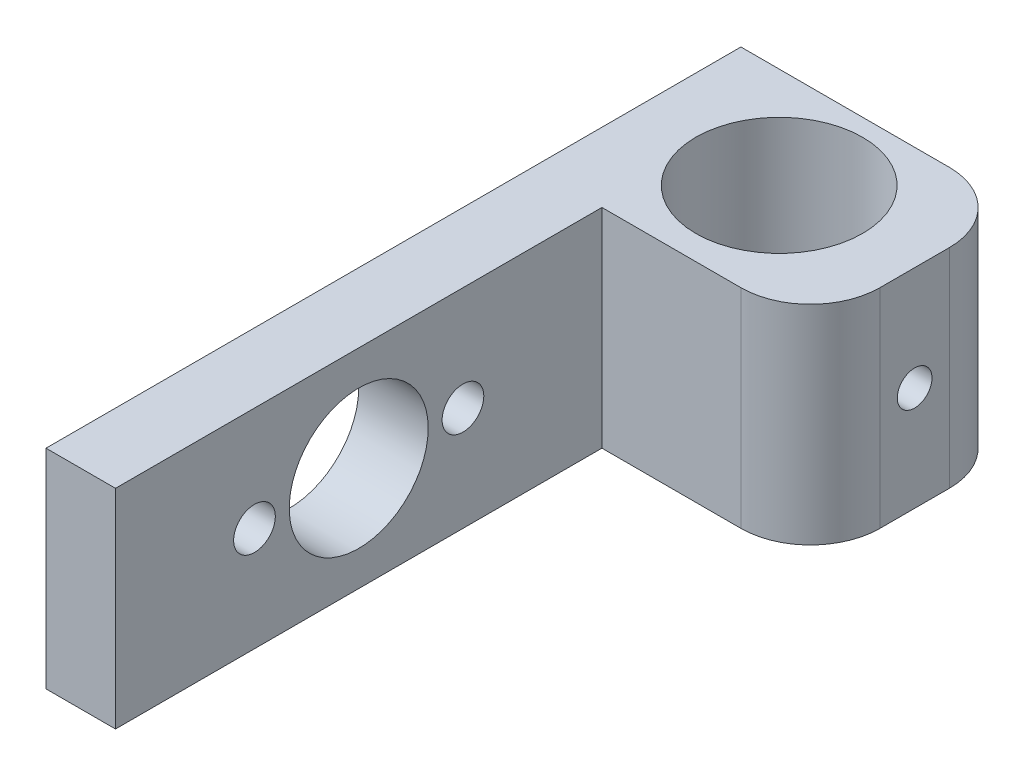
ISO-10303-21;
HEADER;
FILE_DESCRIPTION(('STEP AP214'),'2;1');
FILE_NAME('part.step','',(''),(''),'','','');
FILE_SCHEMA(('AUTOMOTIVE_DESIGN { 1 0 10303 214 1 1 1 1 }'));
ENDSEC;
DATA;
#1=APPLICATION_CONTEXT('core data for automotive mechanical design processes');
#2=APPLICATION_PROTOCOL_DEFINITION('international standard','automotive_design',2000,#1);
#3=PRODUCT_CONTEXT('',#1,'mechanical');
#4=PRODUCT('Part','Part','',(#3));
#5=PRODUCT_RELATED_PRODUCT_CATEGORY('part','',(#4));
#6=PRODUCT_DEFINITION_FORMATION('','',#4);
#7=PRODUCT_DEFINITION_CONTEXT('part definition',#1,'design');
#8=PRODUCT_DEFINITION('design','',#6,#7);
#9=PRODUCT_DEFINITION_SHAPE('','',#8);
#10=(LENGTH_UNIT() NAMED_UNIT(*) SI_UNIT(.MILLI.,.METRE.));
#11=(NAMED_UNIT(*) PLANE_ANGLE_UNIT() SI_UNIT($,.RADIAN.));
#12=(NAMED_UNIT(*) SI_UNIT($,.STERADIAN.) SOLID_ANGLE_UNIT());
#13=UNCERTAINTY_MEASURE_WITH_UNIT(LENGTH_MEASURE(1.E-05),#10,'distance_accuracy_value','');
#14=(GEOMETRIC_REPRESENTATION_CONTEXT(3) GLOBAL_UNCERTAINTY_ASSIGNED_CONTEXT((#13)) GLOBAL_UNIT_ASSIGNED_CONTEXT((#10,
#11,#12)) REPRESENTATION_CONTEXT('',''));
#15=CARTESIAN_POINT('',(0.,0.,0.));
#16=DIRECTION('',(0.,0.,1.));
#17=DIRECTION('',(1.,0.,0.));
#18=AXIS2_PLACEMENT_3D('',#15,#16,#17);
#19=CARTESIAN_POINT('',(2.5,0.,0.));
#20=DIRECTION('',(-1.,0.,0.));
#21=DIRECTION('',(0.,0.,1.));
#22=AXIS2_PLACEMENT_3D('',#19,#20,#21);
#23=PLANE('',#22);
#24=CARTESIAN_POINT('',(2.5,7.5,-25.));
#25=DIRECTION('',(1.,0.,0.));
#26=DIRECTION('',(0.,0.,-1.));
#27=AXIS2_PLACEMENT_3D('',#24,#25,#26);
#28=CIRCLE('',#27,1.5);
#29=CARTESIAN_POINT('',(2.5,7.5,-26.5));
#30=VERTEX_POINT('',#29);
#31=EDGE_CURVE('E173',#30,#30,#28,.T.);
#32=ORIENTED_EDGE('',*,*,#31,.F.);
#33=EDGE_LOOP('',(#32));
#34=FACE_BOUND('',#33,.T.);
#35=CARTESIAN_POINT('',(2.5,7.5,-17.5));
#36=DIRECTION('',(1.,0.,0.));
#37=DIRECTION('',(0.,0.,-1.));
#38=AXIS2_PLACEMENT_3D('',#35,#36,#37);
#39=CIRCLE('',#38,5.);
#40=CARTESIAN_POINT('',(2.5,7.5,-22.5));
#41=VERTEX_POINT('',#40);
#42=EDGE_CURVE('E179',#41,#41,#39,.T.);
#43=ORIENTED_EDGE('',*,*,#42,.F.);
#44=EDGE_LOOP('',(#43));
#45=FACE_BOUND('',#44,.T.);
#46=CARTESIAN_POINT('',(2.5,7.5,-10.));
#47=DIRECTION('',(1.,0.,0.));
#48=DIRECTION('',(0.,0.,-1.));
#49=AXIS2_PLACEMENT_3D('',#46,#47,#48);
#50=CIRCLE('',#49,1.5);
#51=CARTESIAN_POINT('',(2.5,7.5,-11.5));
#52=VERTEX_POINT('',#51);
#53=EDGE_CURVE('E185',#52,#52,#50,.T.);
#54=ORIENTED_EDGE('',*,*,#53,.F.);
#55=EDGE_LOOP('',(#54));
#56=FACE_BOUND('',#55,.T.);
#57=DIRECTION('',(0.,0.,-1.));
#58=VECTOR('',#57,1.);
#59=CARTESIAN_POINT('',(2.5,0.,0.));
#60=LINE('',#59,#58);
#61=CARTESIAN_POINT('',(2.5,0.,0.));
#62=VERTEX_POINT('',#61);
#63=CARTESIAN_POINT('',(2.5,0.,-35.));
#64=VERTEX_POINT('',#63);
#65=EDGE_CURVE('E102',#62,#64,#60,.T.);
#66=ORIENTED_EDGE('',*,*,#65,.T.);
#67=DIRECTION('',(0.,1.,0.));
#68=VECTOR('',#67,1.);
#69=CARTESIAN_POINT('',(2.5,0.,-35.));
#70=LINE('',#69,#68);
#71=CARTESIAN_POINT('',(2.5,15.,-35.));
#72=VERTEX_POINT('',#71);
#73=EDGE_CURVE('E154',#64,#72,#70,.T.);
#74=ORIENTED_EDGE('',*,*,#73,.T.);
#75=DIRECTION('',(0.,0.,1.));
#76=VECTOR('',#75,1.);
#77=CARTESIAN_POINT('',(2.5,15.,0.));
#78=LINE('',#77,#76);
#79=CARTESIAN_POINT('',(2.5,15.,0.));
#80=VERTEX_POINT('',#79);
#81=EDGE_CURVE('E113',#72,#80,#78,.T.);
#82=ORIENTED_EDGE('',*,*,#81,.T.);
#83=DIRECTION('',(0.,-1.,0.));
#84=VECTOR('',#83,1.);
#85=CARTESIAN_POINT('',(2.5,0.,0.));
#86=LINE('',#85,#84);
#87=EDGE_CURVE('E114',#80,#62,#86,.T.);
#88=ORIENTED_EDGE('',*,*,#87,.T.);
#89=EDGE_LOOP('',(#66,#74,#82,#88));
#90=FACE_BOUND('',#89,.T.);
#91=ADVANCED_FACE('F33',(#34,#45,#56,#90),#23,.F.);
#92=CARTESIAN_POINT('',(-2.5,0.,0.));
#93=DIRECTION('',(-1.,0.,0.));
#94=DIRECTION('',(0.,0.,1.));
#95=AXIS2_PLACEMENT_3D('',#92,#93,#94);
#96=PLANE('',#95);
#97=DIRECTION('',(0.,-1.,0.));
#98=VECTOR('',#97,1.);
#99=CARTESIAN_POINT('',(-2.5,0.,0.));
#100=LINE('',#99,#98);
#101=CARTESIAN_POINT('',(-2.5,15.,0.));
#102=VERTEX_POINT('',#101);
#103=CARTESIAN_POINT('',(-2.5,0.,0.));
#104=VERTEX_POINT('',#103);
#105=EDGE_CURVE('E125',#102,#104,#100,.T.);
#106=ORIENTED_EDGE('',*,*,#105,.F.);
#107=DIRECTION('',(0.,0.,1.));
#108=VECTOR('',#107,1.);
#109=CARTESIAN_POINT('',(-2.5,15.,0.));
#110=LINE('',#109,#108);
#111=CARTESIAN_POINT('',(-2.5,15.,-50.));
#112=VERTEX_POINT('',#111);
#113=EDGE_CURVE('E121',#112,#102,#110,.T.);
#114=ORIENTED_EDGE('',*,*,#113,.F.);
#115=DIRECTION('',(0.,1.,0.));
#116=VECTOR('',#115,1.);
#117=CARTESIAN_POINT('',(-2.5,0.,-50.));
#118=LINE('',#117,#116);
#119=CARTESIAN_POINT('',(-2.5,0.,-50.));
#120=VERTEX_POINT('',#119);
#121=EDGE_CURVE('E195',#120,#112,#118,.T.);
#122=ORIENTED_EDGE('',*,*,#121,.F.);
#123=DIRECTION('',(0.,0.,-1.));
#124=VECTOR('',#123,1.);
#125=CARTESIAN_POINT('',(-2.5,0.,0.));
#126=LINE('',#125,#124);
#127=EDGE_CURVE('E193',#104,#120,#126,.T.);
#128=ORIENTED_EDGE('',*,*,#127,.F.);
#129=EDGE_LOOP('',(#106,#114,#122,#128));
#130=FACE_BOUND('',#129,.T.);
#131=CARTESIAN_POINT('',(-2.5,7.5,-17.5));
#132=DIRECTION('',(1.,0.,0.));
#133=DIRECTION('',(0.,0.,-1.));
#134=AXIS2_PLACEMENT_3D('',#131,#132,#133);
#135=CIRCLE('',#134,5.);
#136=CARTESIAN_POINT('',(-2.5,7.5,-22.5));
#137=VERTEX_POINT('',#136);
#138=EDGE_CURVE('E176',#137,#137,#135,.T.);
#139=ORIENTED_EDGE('',*,*,#138,.T.);
#140=EDGE_LOOP('',(#139));
#141=FACE_BOUND('',#140,.T.);
#142=CARTESIAN_POINT('',(-2.5,7.5,-10.));
#143=DIRECTION('',(1.,0.,0.));
#144=DIRECTION('',(0.,0.,-1.));
#145=AXIS2_PLACEMENT_3D('',#142,#143,#144);
#146=CIRCLE('',#145,1.5);
#147=CARTESIAN_POINT('',(-2.5,7.5,-11.5));
#148=VERTEX_POINT('',#147);
#149=EDGE_CURVE('E182',#148,#148,#146,.T.);
#150=ORIENTED_EDGE('',*,*,#149,.T.);
#151=EDGE_LOOP('',(#150));
#152=FACE_BOUND('',#151,.T.);
#153=CARTESIAN_POINT('',(-2.5,7.5,-25.));
#154=DIRECTION('',(1.,0.,0.));
#155=DIRECTION('',(0.,0.,-1.));
#156=AXIS2_PLACEMENT_3D('',#153,#154,#155);
#157=CIRCLE('',#156,1.5);
#158=CARTESIAN_POINT('',(-2.5,7.5,-26.5));
#159=VERTEX_POINT('',#158);
#160=EDGE_CURVE('E172',#159,#159,#157,.T.);
#161=ORIENTED_EDGE('',*,*,#160,.T.);
#162=EDGE_LOOP('',(#161));
#163=FACE_BOUND('',#162,.T.);
#164=ADVANCED_FACE('F203',(#130,#141,#152,#163),#96,.T.);
#165=CARTESIAN_POINT('',(2.5,0.,0.));
#166=DIRECTION('',(0.,0.,-1.));
#167=DIRECTION('',(-1.,0.,0.));
#168=AXIS2_PLACEMENT_3D('',#165,#166,#167);
#169=PLANE('',#168);
#170=ORIENTED_EDGE('',*,*,#105,.T.);
#171=DIRECTION('',(-1.,0.,0.));
#172=VECTOR('',#171,1.);
#173=CARTESIAN_POINT('',(2.5,0.,0.));
#174=LINE('',#173,#172);
#175=EDGE_CURVE('E107',#62,#104,#174,.T.);
#176=ORIENTED_EDGE('',*,*,#175,.F.);
#177=ORIENTED_EDGE('',*,*,#87,.F.);
#178=DIRECTION('',(-1.,0.,0.));
#179=VECTOR('',#178,1.);
#180=CARTESIAN_POINT('',(2.5,15.,0.));
#181=LINE('',#180,#179);
#182=EDGE_CURVE('E191',#80,#102,#181,.T.);
#183=ORIENTED_EDGE('',*,*,#182,.T.);
#184=EDGE_LOOP('',(#170,#176,#177,#183));
#185=FACE_BOUND('',#184,.T.);
#186=ADVANCED_FACE('F123',(#185),#169,.F.);
#187=CARTESIAN_POINT('',(2.5,0.,0.));
#188=DIRECTION('',(0.,1.,0.));
#189=DIRECTION('',(0.,0.,1.));
#190=AXIS2_PLACEMENT_3D('',#187,#188,#189);
#191=PLANE('',#190);
#192=CARTESIAN_POINT('',(7.5,0.,-42.75390625));
#193=DIRECTION('',(0.,1.,0.));
#194=DIRECTION('',(0.,0.,1.));
#195=AXIS2_PLACEMENT_3D('',#192,#193,#194);
#196=CIRCLE('',#195,6.);
#197=CARTESIAN_POINT('',(7.5,0.,-36.75390625));
#198=VERTEX_POINT('',#197);
#199=EDGE_CURVE('E167',#198,#198,#196,.T.);
#200=ORIENTED_EDGE('',*,*,#199,.T.);
#201=EDGE_LOOP('',(#200));
#202=FACE_BOUND('',#201,.T.);
#203=DIRECTION('',(0.,0.,-1.));
#204=VECTOR('',#203,1.);
#205=CARTESIAN_POINT('',(17.5,0.,-50.));
#206=LINE('',#205,#204);
#207=CARTESIAN_POINT('',(17.5,0.,-40.));
#208=VERTEX_POINT('',#207);
#209=CARTESIAN_POINT('',(17.5,0.,-45.));
#210=VERTEX_POINT('',#209);
#211=EDGE_CURVE('E146',#208,#210,#206,.T.);
#212=ORIENTED_EDGE('',*,*,#211,.F.);
#213=CARTESIAN_POINT('',(12.5,0.,-40.));
#214=DIRECTION('',(0.,1.,0.));
#215=DIRECTION('',(0.,0.,1.));
#216=AXIS2_PLACEMENT_3D('',#213,#214,#215);
#217=CIRCLE('',#216,5.);
#218=CARTESIAN_POINT('',(12.5,0.,-35.));
#219=VERTEX_POINT('',#218);
#220=EDGE_CURVE('E46',#208,#219,#217,.F.);
#221=ORIENTED_EDGE('',*,*,#220,.T.);
#222=DIRECTION('',(1.,0.,0.));
#223=VECTOR('',#222,1.);
#224=CARTESIAN_POINT('',(-2.5,0.,-35.));
#225=LINE('',#224,#223);
#226=EDGE_CURVE('E110',#64,#219,#225,.T.);
#227=ORIENTED_EDGE('',*,*,#226,.F.);
#228=ORIENTED_EDGE('',*,*,#65,.F.);
#229=ORIENTED_EDGE('',*,*,#175,.T.);
#230=ORIENTED_EDGE('',*,*,#127,.T.);
#231=DIRECTION('',(-1.,0.,0.));
#232=VECTOR('',#231,1.);
#233=CARTESIAN_POINT('',(2.5,0.,-50.));
#234=LINE('',#233,#232);
#235=CARTESIAN_POINT('',(12.5,0.,-50.));
#236=VERTEX_POINT('',#235);
#237=EDGE_CURVE('E127',#236,#120,#234,.T.);
#238=ORIENTED_EDGE('',*,*,#237,.F.);
#239=CARTESIAN_POINT('',(12.5,0.,-45.));
#240=DIRECTION('',(0.,1.,0.));
#241=DIRECTION('',(0.,0.,1.));
#242=AXIS2_PLACEMENT_3D('',#239,#240,#241);
#243=CIRCLE('',#242,5.);
#244=EDGE_CURVE('E58',#236,#210,#243,.F.);
#245=ORIENTED_EDGE('',*,*,#244,.T.);
#246=EDGE_LOOP('',(#212,#221,#227,#228,#229,#230,#238,#245));
#247=FACE_BOUND('',#246,.T.);
#248=ADVANCED_FACE('F104',(#202,#247),#191,.F.);
#249=CARTESIAN_POINT('',(2.5,0.,-50.));
#250=DIRECTION('',(0.,0.,1.));
#251=DIRECTION('',(1.,0.,0.));
#252=AXIS2_PLACEMENT_3D('',#249,#250,#251);
#253=PLANE('',#252);
#254=DIRECTION('',(-1.,0.,0.));
#255=VECTOR('',#254,1.);
#256=CARTESIAN_POINT('',(2.5,15.,-50.));
#257=LINE('',#256,#255);
#258=CARTESIAN_POINT('',(12.5,15.,-50.));
#259=VERTEX_POINT('',#258);
#260=EDGE_CURVE('E132',#259,#112,#257,.T.);
#261=ORIENTED_EDGE('',*,*,#260,.F.);
#262=DIRECTION('',(0.,1.,0.));
#263=VECTOR('',#262,1.);
#264=CARTESIAN_POINT('',(12.5,0.,-50.));
#265=LINE('',#264,#263);
#266=EDGE_CURVE('E11',#259,#236,#265,.F.);
#267=ORIENTED_EDGE('',*,*,#266,.T.);
#268=ORIENTED_EDGE('',*,*,#237,.T.);
#269=ORIENTED_EDGE('',*,*,#121,.T.);
#270=EDGE_LOOP('',(#261,#267,#268,#269));
#271=FACE_BOUND('',#270,.T.);
#272=ADVANCED_FACE('F201',(#271),#253,.F.);
#273=CARTESIAN_POINT('',(2.5,15.,0.));
#274=DIRECTION('',(0.,-1.,0.));
#275=DIRECTION('',(0.,0.,-1.));
#276=AXIS2_PLACEMENT_3D('',#273,#274,#275);
#277=PLANE('',#276);
#278=CARTESIAN_POINT('',(7.5,15.,-42.75390625));
#279=DIRECTION('',(0.,1.,0.));
#280=DIRECTION('',(0.,0.,1.));
#281=AXIS2_PLACEMENT_3D('',#278,#279,#280);
#282=CIRCLE('',#281,6.);
#283=CARTESIAN_POINT('',(7.5,15.,-36.75390625));
#284=VERTEX_POINT('',#283);
#285=EDGE_CURVE('E357',#284,#284,#282,.T.);
#286=ORIENTED_EDGE('',*,*,#285,.F.);
#287=EDGE_LOOP('',(#286));
#288=FACE_BOUND('',#287,.T.);
#289=DIRECTION('',(1.,0.,0.));
#290=VECTOR('',#289,1.);
#291=CARTESIAN_POINT('',(-2.5,15.,-35.));
#292=LINE('',#291,#290);
#293=CARTESIAN_POINT('',(12.5,15.,-35.));
#294=VERTEX_POINT('',#293);
#295=EDGE_CURVE('E162',#72,#294,#292,.T.);
#296=ORIENTED_EDGE('',*,*,#295,.T.);
#297=CARTESIAN_POINT('',(12.5,15.,-40.));
#298=DIRECTION('',(0.,-1.,0.));
#299=DIRECTION('',(0.,0.,-1.));
#300=AXIS2_PLACEMENT_3D('',#297,#298,#299);
#301=CIRCLE('',#300,5.);
#302=CARTESIAN_POINT('',(17.5,15.,-40.));
#303=VERTEX_POINT('',#302);
#304=EDGE_CURVE('E137',#294,#303,#301,.F.);
#305=ORIENTED_EDGE('',*,*,#304,.T.);
#306=DIRECTION('',(0.,0.,-1.));
#307=VECTOR('',#306,1.);
#308=CARTESIAN_POINT('',(17.5,15.,-50.));
#309=LINE('',#308,#307);
#310=CARTESIAN_POINT('',(17.5,15.,-45.));
#311=VERTEX_POINT('',#310);
#312=EDGE_CURVE('E155',#303,#311,#309,.T.);
#313=ORIENTED_EDGE('',*,*,#312,.T.);
#314=CARTESIAN_POINT('',(12.5,15.,-45.));
#315=DIRECTION('',(0.,-1.,0.));
#316=DIRECTION('',(0.,0.,-1.));
#317=AXIS2_PLACEMENT_3D('',#314,#315,#316);
#318=CIRCLE('',#317,5.);
#319=EDGE_CURVE('E130',#311,#259,#318,.F.);
#320=ORIENTED_EDGE('',*,*,#319,.T.);
#321=ORIENTED_EDGE('',*,*,#260,.T.);
#322=ORIENTED_EDGE('',*,*,#113,.T.);
#323=ORIENTED_EDGE('',*,*,#182,.F.);
#324=ORIENTED_EDGE('',*,*,#81,.F.);
#325=EDGE_LOOP('',(#296,#305,#313,#320,#321,#322,#323,#324));
#326=FACE_BOUND('',#325,.T.);
#327=ADVANCED_FACE('F161',(#288,#326),#277,.F.);
#328=CARTESIAN_POINT('',(2.5,7.5,-10.));
#329=DIRECTION('',(-1.,0.,0.));
#330=DIRECTION('',(0.,0.,1.));
#331=AXIS2_PLACEMENT_3D('',#328,#329,#330);
#332=CYLINDRICAL_SURFACE('',#331,1.5);
#333=ORIENTED_EDGE('',*,*,#53,.T.);
#334=EDGE_LOOP('',(#333));
#335=FACE_BOUND('',#334,.T.);
#336=ORIENTED_EDGE('',*,*,#149,.F.);
#337=EDGE_LOOP('',(#336));
#338=FACE_BOUND('',#337,.T.);
#339=ADVANCED_FACE('F224',(#335,#338),#332,.F.);
#340=CARTESIAN_POINT('',(2.5,7.5,-17.5));
#341=DIRECTION('',(-1.,0.,0.));
#342=DIRECTION('',(0.,0.,1.));
#343=AXIS2_PLACEMENT_3D('',#340,#341,#342);
#344=CYLINDRICAL_SURFACE('',#343,5.);
#345=ORIENTED_EDGE('',*,*,#42,.T.);
#346=EDGE_LOOP('',(#345));
#347=FACE_BOUND('',#346,.T.);
#348=ORIENTED_EDGE('',*,*,#138,.F.);
#349=EDGE_LOOP('',(#348));
#350=FACE_BOUND('',#349,.T.);
#351=ADVANCED_FACE('F259',(#347,#350),#344,.F.);
#352=CARTESIAN_POINT('',(2.5,7.5,-25.));
#353=DIRECTION('',(-1.,0.,0.));
#354=DIRECTION('',(0.,0.,1.));
#355=AXIS2_PLACEMENT_3D('',#352,#353,#354);
#356=CYLINDRICAL_SURFACE('',#355,1.5);
#357=ORIENTED_EDGE('',*,*,#31,.T.);
#358=EDGE_LOOP('',(#357));
#359=FACE_BOUND('',#358,.T.);
#360=ORIENTED_EDGE('',*,*,#160,.F.);
#361=EDGE_LOOP('',(#360));
#362=FACE_BOUND('',#361,.T.);
#363=ADVANCED_FACE('F266',(#359,#362),#356,.F.);
#364=CARTESIAN_POINT('',(-2.5,0.,-35.));
#365=DIRECTION('',(0.,0.,1.));
#366=DIRECTION('',(1.,0.,0.));
#367=AXIS2_PLACEMENT_3D('',#364,#365,#366);
#368=PLANE('',#367);
#369=ORIENTED_EDGE('',*,*,#226,.T.);
#370=DIRECTION('',(0.,1.,0.));
#371=VECTOR('',#370,1.);
#372=CARTESIAN_POINT('',(12.5,0.,-35.));
#373=LINE('',#372,#371);
#374=EDGE_CURVE('E126',#219,#294,#373,.T.);
#375=ORIENTED_EDGE('',*,*,#374,.T.);
#376=ORIENTED_EDGE('',*,*,#295,.F.);
#377=ORIENTED_EDGE('',*,*,#73,.F.);
#378=EDGE_LOOP('',(#369,#375,#376,#377));
#379=FACE_BOUND('',#378,.T.);
#380=ADVANCED_FACE('F151',(#379),#368,.T.);
#381=CARTESIAN_POINT('',(17.5,0.,-50.));
#382=DIRECTION('',(1.,0.,0.));
#383=DIRECTION('',(0.,0.,-1.));
#384=AXIS2_PLACEMENT_3D('',#381,#382,#383);
#385=PLANE('',#384);
#386=CARTESIAN_POINT('',(17.5,7.5,-42.5));
#387=DIRECTION('',(1.,0.,0.));
#388=DIRECTION('',(0.,0.,-1.));
#389=AXIS2_PLACEMENT_3D('',#386,#387,#388);
#390=CIRCLE('',#389,1.25);
#391=CARTESIAN_POINT('',(17.5,7.5,-43.75));
#392=VERTEX_POINT('',#391);
#393=EDGE_CURVE('E360',#392,#392,#390,.T.);
#394=ORIENTED_EDGE('',*,*,#393,.F.);
#395=EDGE_LOOP('',(#394));
#396=FACE_BOUND('',#395,.T.);
#397=ORIENTED_EDGE('',*,*,#312,.F.);
#398=DIRECTION('',(0.,1.,0.));
#399=VECTOR('',#398,1.);
#400=CARTESIAN_POINT('',(17.5,0.,-40.));
#401=LINE('',#400,#399);
#402=EDGE_CURVE('E142',#303,#208,#401,.F.);
#403=ORIENTED_EDGE('',*,*,#402,.T.);
#404=ORIENTED_EDGE('',*,*,#211,.T.);
#405=DIRECTION('',(0.,1.,0.));
#406=VECTOR('',#405,1.);
#407=CARTESIAN_POINT('',(17.5,15.,-45.));
#408=LINE('',#407,#406);
#409=EDGE_CURVE('E139',#210,#311,#408,.T.);
#410=ORIENTED_EDGE('',*,*,#409,.T.);
#411=EDGE_LOOP('',(#397,#403,#404,#410));
#412=FACE_BOUND('',#411,.T.);
#413=ADVANCED_FACE('F164',(#396,#412),#385,.T.);
#414=CARTESIAN_POINT('',(7.5,0.,-42.75390625));
#415=DIRECTION('',(0.,1.,0.));
#416=DIRECTION('',(0.,0.,1.));
#417=AXIS2_PLACEMENT_3D('',#414,#415,#416);
#418=CYLINDRICAL_SURFACE('',#417,6.);
#419=CARTESIAN_POINT('',(13.4167387335602,7.5,-43.75));
#420=CARTESIAN_POINT('',(13.4167400077954,7.56974324668674,-43.7499975506617));
#421=CARTESIAN_POINT('',(13.4177337593835,7.63951730882965,-43.7441440613288));
#422=CARTESIAN_POINT('',(13.4215758942093,7.77709809268331,-43.7208978482761));
#423=CARTESIAN_POINT('',(13.4244256861345,7.84490327920308,-43.7034963597277));
#424=CARTESIAN_POINT('',(13.431585066293,7.97654705950757,-43.6576938794426));
#425=CARTESIAN_POINT('',(13.4358934887173,8.0403887730218,-43.6293016694376));
#426=CARTESIAN_POINT('',(13.4453827956153,8.1624061649833,-43.5623379763484));
#427=CARTESIAN_POINT('',(13.4505636213716,8.22058222434314,-43.5237671782373));
#428=CARTESIAN_POINT('',(13.4611358779627,8.33020357749358,-43.4371162408173));
#429=CARTESIAN_POINT('',(13.4665287863106,8.38158346841466,-43.3889535128124));
#430=CARTESIAN_POINT('',(13.476708318554,8.47557143368581,-43.2846580519193));
#431=CARTESIAN_POINT('',(13.4814949242603,8.51817924489797,-43.2285250800315));
#432=CARTESIAN_POINT('',(13.489739344699,8.59350492537374,-43.109678937748));
#433=CARTESIAN_POINT('',(13.4931937569996,8.6261974260254,-43.0469494324452));
#434=CARTESIAN_POINT('',(13.4981409728927,8.68056648451002,-42.9168141595911));
#435=CARTESIAN_POINT('',(13.4996339953849,8.70224427146763,-42.849408914757));
#436=CARTESIAN_POINT('',(13.5002422571054,8.73369457532439,-42.7129103916525));
#437=CARTESIAN_POINT('',(13.4993921333176,8.74363744525988,-42.6438565028178));
#438=CARTESIAN_POINT('',(13.495241927309,8.75191901545796,-42.5051332667403));
#439=CARTESIAN_POINT('',(13.4919420012647,8.7502584553903,-42.4354639590107));
#440=CARTESIAN_POINT('',(13.483056362156,8.735506642405,-42.2981298875272));
#441=CARTESIAN_POINT('',(13.4774911546459,8.72251676859139,-42.2304528343536));
#442=CARTESIAN_POINT('',(13.46444554504,8.68568723114659,-42.0983143477174));
#443=CARTESIAN_POINT('',(13.4569649808923,8.66184664934033,-42.0338531868925));
#444=CARTESIAN_POINT('',(13.4405443421678,8.60361649665601,-41.9089440376478));
#445=CARTESIAN_POINT('',(13.4315848379741,8.5690802505747,-41.8485670350382));
#446=CARTESIAN_POINT('',(13.413035927754,8.49054834518958,-41.7344184809309));
#447=CARTESIAN_POINT('',(13.4034464273402,8.44655126619081,-41.6806479227028));
#448=CARTESIAN_POINT('',(13.3842798289277,8.34923278304779,-41.5800528708754));
#449=CARTESIAN_POINT('',(13.3747072213355,8.29573495302856,-41.5333979793133));
#450=CARTESIAN_POINT('',(13.3567011109645,8.18149420704964,-41.4497247292716));
#451=CARTESIAN_POINT('',(13.3482675980977,8.12075135526242,-41.4127062854469));
#452=CARTESIAN_POINT('',(13.3334203250947,7.9938926056174,-41.3495339170659));
#453=CARTESIAN_POINT('',(13.3269994845679,7.92779659661038,-41.3233418004558));
#454=CARTESIAN_POINT('',(13.3168219462169,7.7919366556952,-41.2825019710134));
#455=CARTESIAN_POINT('',(13.3130646762347,7.72217351497918,-41.2678517788008));
#456=CARTESIAN_POINT('',(13.3086915327026,7.58305303006851,-41.2508500410415));
#457=CARTESIAN_POINT('',(13.3079907621906,7.51373887891018,-41.2481660751305));
#458=CARTESIAN_POINT('',(13.3095727977856,7.37565807665855,-41.2542817298796));
#459=CARTESIAN_POINT('',(13.3118553533871,7.30689138008409,-41.2630803863606));
#460=CARTESIAN_POINT('',(13.3191082423468,7.17285480766541,-41.2916513504533));
#461=CARTESIAN_POINT('',(13.3240401392731,7.10754925013277,-41.311266833859));
#462=CARTESIAN_POINT('',(13.3360720282212,6.98115736030538,-41.3607416802377));
#463=CARTESIAN_POINT('',(13.3431722559125,6.92007148752126,-41.3906021567529));
#464=CARTESIAN_POINT('',(13.359017861761,6.80253873184651,-41.4603801368602));
#465=CARTESIAN_POINT('',(13.3677926586465,6.74620573304002,-41.5004826460286));
#466=CARTESIAN_POINT('',(13.3860712328524,6.64096581514504,-41.5893382038589));
#467=CARTESIAN_POINT('',(13.3955751281325,6.59206010153615,-41.6380926539885));
#468=CARTESIAN_POINT('',(13.4147114574466,6.50174983773034,-41.7443651920547));
#469=CARTESIAN_POINT('',(13.4243407745908,6.46057431738032,-41.8020787583534));
#470=CARTESIAN_POINT('',(13.4426101707039,6.38850005317212,-41.9237474165327));
#471=CARTESIAN_POINT('',(13.4512502516281,6.35760128900207,-41.9877024960767));
#472=CARTESIAN_POINT('',(13.4667958790343,6.30704241508134,-42.1200469911921));
#473=CARTESIAN_POINT('',(13.4737030548572,6.2873717259207,-42.1884321647131));
#474=CARTESIAN_POINT('',(13.4852529597915,6.25989497618194,-42.3277296702338));
#475=CARTESIAN_POINT('',(13.4898960315427,6.25208711995447,-42.3986416180981));
#476=CARTESIAN_POINT('',(13.4965653161462,6.24868262620171,-42.5393053167587));
#477=CARTESIAN_POINT('',(13.4986471109394,6.25281985012794,-42.6090480598189));
#478=CARTESIAN_POINT('',(13.500391886196,6.2726495339532,-42.7468988898218));
#479=CARTESIAN_POINT('',(13.5000550120851,6.28834129906975,-42.8150070747974));
#480=CARTESIAN_POINT('',(13.4972542386614,6.3305923641642,-42.9469139321007));
#481=CARTESIAN_POINT('',(13.4948129081543,6.35703478655684,-43.0107506117937));
#482=CARTESIAN_POINT('',(13.4883170270629,6.42001415626258,-43.1331412526116));
#483=CARTESIAN_POINT('',(13.4842623938663,6.45655162048338,-43.1916949430222));
#484=CARTESIAN_POINT('',(13.4751202776846,6.53918930428422,-43.3026096534999));
#485=CARTESIAN_POINT('',(13.4700211372368,6.58539759628837,-43.354889168864));
#486=CARTESIAN_POINT('',(13.4595586108545,6.68584799559966,-43.4510477615695));
#487=CARTESIAN_POINT('',(13.4541951634099,6.7400919789394,-43.4949248717653));
#488=CARTESIAN_POINT('',(13.4438797490677,6.85590727578629,-43.5735970094237));
#489=CARTESIAN_POINT('',(13.4389341682082,6.91756607127303,-43.6082641386074));
#490=CARTESIAN_POINT('',(13.4302318491957,7.04588002347574,-43.6667206990804));
#491=CARTESIAN_POINT('',(13.4264741460256,7.1125310698123,-43.6905189671248));
#492=CARTESIAN_POINT('',(13.4213551722094,7.23272275503999,-43.7222770281762));
#493=CARTESIAN_POINT('',(13.4196368791354,7.28562279363465,-43.7326548103201));
#494=CARTESIAN_POINT('',(13.4173281827555,7.39234244992587,-43.7465171513742));
#495=CARTESIAN_POINT('',(13.4167377499205,7.44616204350987,-43.7500018907547));
#496=CARTESIAN_POINT('',(13.4167387335602,7.5,-43.75));
#497=B_SPLINE_CURVE_WITH_KNOTS('',3,(#419,#420,#421,#422,#423,#424,#425,#426,#427,#428,#429,
#430,#431,#432,#433,#434,#435,#436,#437,#438,#439,#440,#441,#442,#443,#444,#445,#446,#447,#448,
#449,#450,#451,#452,#453,#454,#455,#456,#457,#458,#459,#460,#461,#462,#463,#464,#465,#466,#467,
#468,#469,#470,#471,#472,#473,#474,#475,#476,#477,#478,#479,#480,#481,#482,#483,#484,#485,#486,
#487,#488,#489,#490,#491,#492,#493,#494,#495,#496),.UNSPECIFIED.,.T.,.F.,(4,2,2,2,2,2,2,2,2,2,2,
2,2,2,2,2,2,2,2,2,2,2,2,2,2,2,2,2,2,2,2,2,2,2,2,2,2,2,4),(0.,0.209033673387417,
0.418226183204796,0.627251889303491,0.836263532495572,1.04715933603153,1.25806146493161,
1.46949872744372,1.68091239062611,1.88921771159555,2.09750975410004,2.3039568232591,
2.51042136499271,2.71985299552608,2.92931607538115,3.14317837745654,3.35703878539666,
3.57013818270476,3.78319179054231,3.99028836083499,4.19736754265101,4.40152051473814,
4.60569568352129,4.81385796269949,5.02205399146659,5.23568257854515,5.44931074338727,
5.66273728804523,5.87613152360541,6.08480823503577,6.2934723996173,6.49992624078868,
6.70639065520634,6.91529893002761,7.12425605418552,7.33597895374127,7.54752940756618,
7.70889614921466,7.87025866598065),.UNSPECIFIED.);
#498=CARTESIAN_POINT('',(13.4167387335602,7.5,-43.75));
#499=VERTEX_POINT('',#498);
#500=EDGE_CURVE('E37',#499,#499,#497,.T.);
#501=ORIENTED_EDGE('',*,*,#500,.T.);
#502=EDGE_LOOP('',(#501));
#503=FACE_BOUND('',#502,.T.);
#504=ORIENTED_EDGE('',*,*,#199,.F.);
#505=EDGE_LOOP('',(#504));
#506=FACE_BOUND('',#505,.T.);
#507=ORIENTED_EDGE('',*,*,#285,.T.);
#508=EDGE_LOOP('',(#507));
#509=FACE_BOUND('',#508,.T.);
#510=ADVANCED_FACE('F213',(#503,#506,#509),#418,.F.);
#511=CARTESIAN_POINT('',(12.5,0.,-40.));
#512=DIRECTION('',(0.,1.,0.));
#513=DIRECTION('',(0.,0.,1.));
#514=AXIS2_PLACEMENT_3D('',#511,#512,#513);
#515=CYLINDRICAL_SURFACE('',#514,5.);
#516=ORIENTED_EDGE('',*,*,#220,.F.);
#517=ORIENTED_EDGE('',*,*,#402,.F.);
#518=ORIENTED_EDGE('',*,*,#304,.F.);
#519=ORIENTED_EDGE('',*,*,#374,.F.);
#520=EDGE_LOOP('',(#516,#517,#518,#519));
#521=FACE_BOUND('',#520,.T.);
#522=ADVANCED_FACE('F157',(#521),#515,.T.);
#523=CARTESIAN_POINT('',(12.5,0.,-45.));
#524=DIRECTION('',(0.,-1.,0.));
#525=DIRECTION('',(0.,0.,-1.));
#526=AXIS2_PLACEMENT_3D('',#523,#524,#525);
#527=CYLINDRICAL_SURFACE('',#526,5.);
#528=ORIENTED_EDGE('',*,*,#244,.F.);
#529=ORIENTED_EDGE('',*,*,#266,.F.);
#530=ORIENTED_EDGE('',*,*,#319,.F.);
#531=ORIENTED_EDGE('',*,*,#409,.F.);
#532=EDGE_LOOP('',(#528,#529,#530,#531));
#533=FACE_BOUND('',#532,.T.);
#534=ADVANCED_FACE('F35',(#533),#527,.T.);
#535=CARTESIAN_POINT('',(2.5,7.5,-42.5));
#536=DIRECTION('',(1.,0.,0.));
#537=DIRECTION('',(0.,0.,-1.));
#538=AXIS2_PLACEMENT_3D('',#535,#536,#537);
#539=CYLINDRICAL_SURFACE('',#538,1.25);
#540=ORIENTED_EDGE('',*,*,#393,.T.);
#541=EDGE_LOOP('',(#540));
#542=FACE_BOUND('',#541,.T.);
#543=ORIENTED_EDGE('',*,*,#500,.F.);
#544=EDGE_LOOP('',(#543));
#545=FACE_BOUND('',#544,.T.);
#546=ADVANCED_FACE('F207',(#542,#545),#539,.F.);
#547=CLOSED_SHELL('',(#91,#164,#186,#248,#272,#327,#339,#351,#363,#380,#413,#510,#522,#534,#546));
#548=MANIFOLD_SOLID_BREP('B2',#547);
#549=ADVANCED_BREP_SHAPE_REPRESENTATION('',(#18,#548),#14);
#550=SHAPE_DEFINITION_REPRESENTATION(#9,#549);
ENDSEC;
END-ISO-10303-21;
